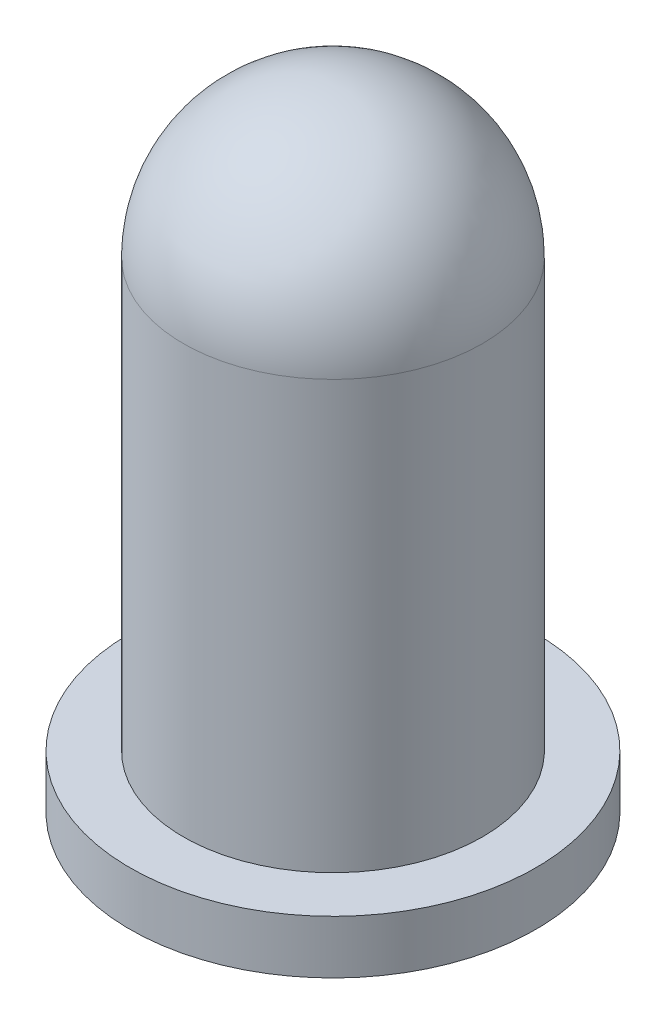
ISO-10303-21;
HEADER;
FILE_DESCRIPTION(('STEP AP214'),'2;1');
FILE_NAME('part.step','',(''),(''),'','','');
FILE_SCHEMA(('AUTOMOTIVE_DESIGN { 1 0 10303 214 1 1 1 1 }'));
ENDSEC;
DATA;
#1=APPLICATION_CONTEXT('core data for automotive mechanical design processes');
#2=APPLICATION_PROTOCOL_DEFINITION('international standard','automotive_design',2000,#1);
#3=PRODUCT_CONTEXT('',#1,'mechanical');
#4=PRODUCT('Part','Part','',(#3));
#5=PRODUCT_RELATED_PRODUCT_CATEGORY('part','',(#4));
#6=PRODUCT_DEFINITION_FORMATION('','',#4);
#7=PRODUCT_DEFINITION_CONTEXT('part definition',#1,'design');
#8=PRODUCT_DEFINITION('design','',#6,#7);
#9=PRODUCT_DEFINITION_SHAPE('','',#8);
#10=(LENGTH_UNIT() NAMED_UNIT(*) SI_UNIT(.MILLI.,.METRE.));
#11=(NAMED_UNIT(*) PLANE_ANGLE_UNIT() SI_UNIT($,.RADIAN.));
#12=(NAMED_UNIT(*) SI_UNIT($,.STERADIAN.) SOLID_ANGLE_UNIT());
#13=UNCERTAINTY_MEASURE_WITH_UNIT(LENGTH_MEASURE(1.E-05),#10,'distance_accuracy_value','');
#14=(GEOMETRIC_REPRESENTATION_CONTEXT(3) GLOBAL_UNCERTAINTY_ASSIGNED_CONTEXT((#13)) GLOBAL_UNIT_ASSIGNED_CONTEXT((#10,
#11,#12)) REPRESENTATION_CONTEXT('',''));
#15=CARTESIAN_POINT('',(0.,0.,0.));
#16=DIRECTION('',(0.,0.,1.));
#17=DIRECTION('',(1.,0.,0.));
#18=AXIS2_PLACEMENT_3D('',#15,#16,#17);
#19=CARTESIAN_POINT('',(0.,5.9,0.));
#20=DIRECTION('',(0.,1.,0.));
#21=DIRECTION('',(-1.,0.,0.));
#22=AXIS2_PLACEMENT_3D('',#19,#20,#21);
#23=CYLINDRICAL_SURFACE('',#22,1.9);
#24=CARTESIAN_POINT('',(0.,0.5,0.));
#25=DIRECTION('',(0.,1.,0.));
#26=DIRECTION('',(-1.,0.,0.));
#27=AXIS2_PLACEMENT_3D('',#24,#25,#26);
#28=CIRCLE('',#27,1.9);
#29=CARTESIAN_POINT('',(-1.9,0.5,0.));
#30=VERTEX_POINT('',#29);
#31=EDGE_CURVE('E39',#30,#30,#28,.T.);
#32=ORIENTED_EDGE('',*,*,#31,.F.);
#33=EDGE_LOOP('',(#32));
#34=FACE_BOUND('',#33,.T.);
#35=CARTESIAN_POINT('',(0.,0.,0.));
#36=DIRECTION('',(0.,1.,0.));
#37=DIRECTION('',(-1.,0.,0.));
#38=AXIS2_PLACEMENT_3D('',#35,#36,#37);
#39=CIRCLE('',#38,1.9);
#40=CARTESIAN_POINT('',(-1.9,0.,0.));
#41=VERTEX_POINT('',#40);
#42=EDGE_CURVE('E10',#41,#41,#39,.T.);
#43=ORIENTED_EDGE('',*,*,#42,.T.);
#44=EDGE_LOOP('',(#43));
#45=FACE_BOUND('',#44,.T.);
#46=ADVANCED_FACE('F33',(#34,#45),#23,.T.);
#47=CARTESIAN_POINT('',(1.4,0.5,0.));
#48=DIRECTION('',(0.,-1.,0.));
#49=DIRECTION('',(1.,0.,0.));
#50=AXIS2_PLACEMENT_3D('',#47,#48,#49);
#51=PLANE('',#50);
#52=CARTESIAN_POINT('',(0.,0.5,0.));
#53=DIRECTION('',(0.,1.,0.));
#54=DIRECTION('',(-1.,0.,0.));
#55=AXIS2_PLACEMENT_3D('',#52,#53,#54);
#56=CIRCLE('',#55,1.4);
#57=CARTESIAN_POINT('',(-1.4,0.5,0.));
#58=VERTEX_POINT('',#57);
#59=EDGE_CURVE('E43',#58,#58,#56,.T.);
#60=ORIENTED_EDGE('',*,*,#59,.F.);
#61=EDGE_LOOP('',(#60));
#62=FACE_BOUND('',#61,.T.);
#63=ORIENTED_EDGE('',*,*,#31,.T.);
#64=EDGE_LOOP('',(#63));
#65=FACE_BOUND('',#64,.T.);
#66=ADVANCED_FACE('F58',(#62,#65),#51,.F.);
#67=CARTESIAN_POINT('',(0.,5.9,0.));
#68=DIRECTION('',(0.,1.,0.));
#69=DIRECTION('',(-1.,0.,0.));
#70=AXIS2_PLACEMENT_3D('',#67,#68,#69);
#71=CYLINDRICAL_SURFACE('',#70,1.4);
#72=CARTESIAN_POINT('',(0.,4.5,0.));
#73=DIRECTION('',(0.,1.,0.));
#74=DIRECTION('',(-1.,0.,0.));
#75=AXIS2_PLACEMENT_3D('',#72,#73,#74);
#76=CIRCLE('',#75,1.4);
#77=CARTESIAN_POINT('',(-1.4,4.5,0.));
#78=VERTEX_POINT('',#77);
#79=EDGE_CURVE('E47',#78,#78,#76,.T.);
#80=ORIENTED_EDGE('',*,*,#79,.F.);
#81=EDGE_LOOP('',(#80));
#82=FACE_BOUND('',#81,.T.);
#83=ORIENTED_EDGE('',*,*,#59,.T.);
#84=EDGE_LOOP('',(#83));
#85=FACE_BOUND('',#84,.T.);
#86=ADVANCED_FACE('F55',(#82,#85),#71,.T.);
#87=CARTESIAN_POINT('',(0.,4.5,0.));
#88=DIRECTION('',(0.,1.,0.));
#89=DIRECTION('',(1.,0.,0.));
#90=AXIS2_PLACEMENT_3D('',#87,#88,#89);
#91=SPHERICAL_SURFACE('',#90,1.4);
#92=ORIENTED_EDGE('',*,*,#79,.T.);
#93=EDGE_LOOP('',(#92));
#94=FACE_BOUND('',#93,.T.);
#95=ADVANCED_FACE('F53',(#94),#91,.T.);
#96=CARTESIAN_POINT('',(0.,0.,0.));
#97=DIRECTION('',(0.,1.,0.));
#98=DIRECTION('',(-1.,0.,0.));
#99=AXIS2_PLACEMENT_3D('',#96,#97,#98);
#100=PLANE('',#99);
#101=ORIENTED_EDGE('',*,*,#42,.F.);
#102=EDGE_LOOP('',(#101));
#103=FACE_BOUND('',#102,.T.);
#104=ADVANCED_FACE('F70',(#103),#100,.F.);
#105=CLOSED_SHELL('',(#46,#66,#86,#95,#104));
#106=MANIFOLD_SOLID_BREP('B2',#105);
#107=ADVANCED_BREP_SHAPE_REPRESENTATION('',(#18,#106),#14);
#108=SHAPE_DEFINITION_REPRESENTATION(#9,#107);
ENDSEC;
END-ISO-10303-21;
